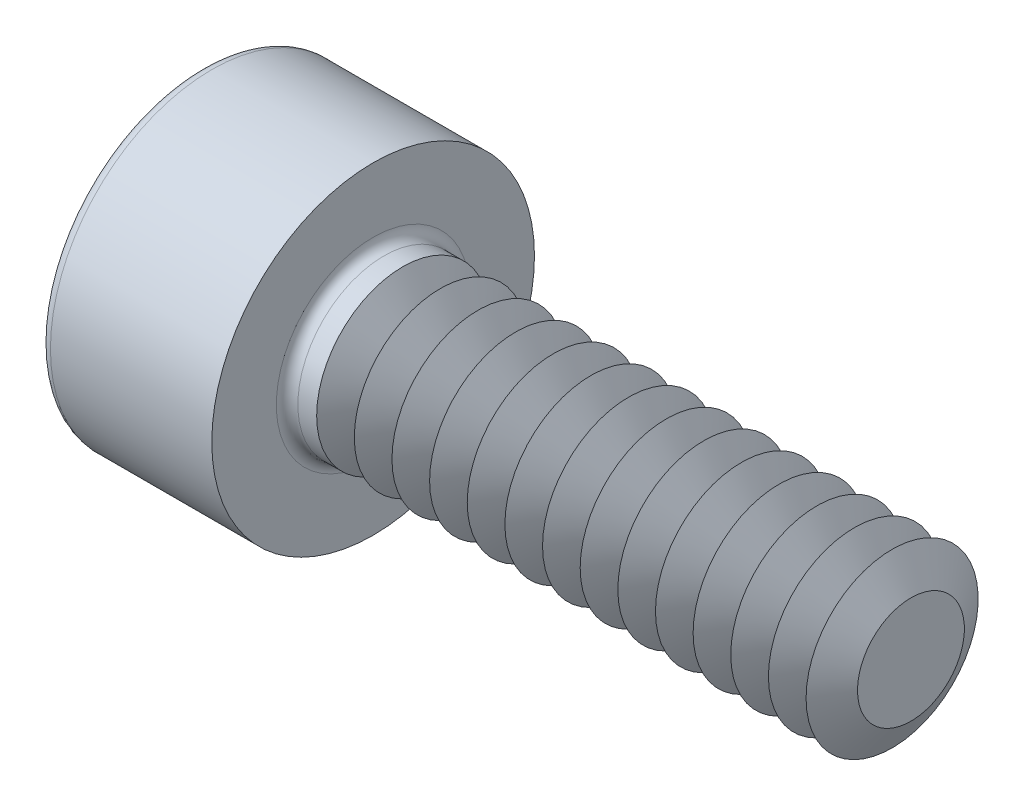
ISO-10303-21;
HEADER;
FILE_DESCRIPTION(('STEP AP214'),'2;1');
FILE_NAME('part.step','',(''),(''),'','','');
FILE_SCHEMA(('AUTOMOTIVE_DESIGN { 1 0 10303 214 1 1 1 1 }'));
ENDSEC;
DATA;
#1=APPLICATION_CONTEXT('core data for automotive mechanical design processes');
#2=APPLICATION_PROTOCOL_DEFINITION('international standard','automotive_design',2000,#1);
#3=PRODUCT_CONTEXT('',#1,'mechanical');
#4=PRODUCT('Part','Part','',(#3));
#5=PRODUCT_RELATED_PRODUCT_CATEGORY('part','',(#4));
#6=PRODUCT_DEFINITION_FORMATION('','',#4);
#7=PRODUCT_DEFINITION_CONTEXT('part definition',#1,'design');
#8=PRODUCT_DEFINITION('design','',#6,#7);
#9=PRODUCT_DEFINITION_SHAPE('','',#8);
#10=(LENGTH_UNIT() NAMED_UNIT(*) SI_UNIT(.MILLI.,.METRE.));
#11=(NAMED_UNIT(*) PLANE_ANGLE_UNIT() SI_UNIT($,.RADIAN.));
#12=(NAMED_UNIT(*) SI_UNIT($,.STERADIAN.) SOLID_ANGLE_UNIT());
#13=UNCERTAINTY_MEASURE_WITH_UNIT(LENGTH_MEASURE(1.E-05),#10,'distance_accuracy_value','');
#14=(GEOMETRIC_REPRESENTATION_CONTEXT(3) GLOBAL_UNCERTAINTY_ASSIGNED_CONTEXT((#13)) GLOBAL_UNIT_ASSIGNED_CONTEXT((#10,
#11,#12)) REPRESENTATION_CONTEXT('',''));
#15=CARTESIAN_POINT('',(0.,0.,0.));
#16=DIRECTION('',(0.,0.,1.));
#17=DIRECTION('',(1.,0.,0.));
#18=AXIS2_PLACEMENT_3D('',#15,#16,#17);
#19=CARTESIAN_POINT('',(5.025,0.,0.));
#20=DIRECTION('',(-1.,0.,0.));
#21=DIRECTION('',(0.,0.,1.));
#22=AXIS2_PLACEMENT_3D('',#19,#20,#21);
#23=CONICAL_SURFACE('',#22,0.8,1.04718484902493);
#24=CARTESIAN_POINT('',(5.2,0.,0.));
#25=DIRECTION('',(-1.,0.,0.));
#26=DIRECTION('',(0.,0.,1.));
#27=AXIS2_PLACEMENT_3D('',#24,#25,#26);
#28=CIRCLE('',#27,0.4969);
#29=CARTESIAN_POINT('',(5.2,0.,0.4969));
#30=VERTEX_POINT('',#29);
#31=EDGE_CURVE('E335',#30,#30,#28,.T.);
#32=ORIENTED_EDGE('',*,*,#31,.T.);
#33=EDGE_LOOP('',(#32));
#34=FACE_BOUND('',#33,.T.);
#35=CARTESIAN_POINT('',(5.025,0.,0.));
#36=DIRECTION('',(-1.,0.,0.));
#37=DIRECTION('',(0.,0.,1.));
#38=AXIS2_PLACEMENT_3D('',#35,#36,#37);
#39=CIRCLE('',#38,0.8);
#40=CARTESIAN_POINT('',(5.025,0.,0.8));
#41=VERTEX_POINT('',#40);
#42=EDGE_CURVE('E322',#41,#41,#39,.T.);
#43=ORIENTED_EDGE('',*,*,#42,.F.);
#44=EDGE_LOOP('',(#43));
#45=FACE_BOUND('',#44,.T.);
#46=ADVANCED_FACE('F47',(#34,#45),#23,.T.);
#47=CARTESIAN_POINT('',(5.2,0.,0.));
#48=DIRECTION('',(1.,0.,0.));
#49=DIRECTION('',(0.,0.,-1.));
#50=AXIS2_PLACEMENT_3D('',#47,#48,#49);
#51=CONICAL_SURFACE('',#50,0.4969,1.04718484902493);
#52=CARTESIAN_POINT('',(5.375,0.,0.));
#53=DIRECTION('',(-1.,0.,0.));
#54=DIRECTION('',(0.,0.,1.));
#55=AXIS2_PLACEMENT_3D('',#52,#53,#54);
#56=CIRCLE('',#55,0.8);
#57=CARTESIAN_POINT('',(5.375,0.,0.8));
#58=VERTEX_POINT('',#57);
#59=EDGE_CURVE('E329',#58,#58,#56,.T.);
#60=ORIENTED_EDGE('',*,*,#59,.T.);
#61=EDGE_LOOP('',(#60));
#62=FACE_BOUND('',#61,.T.);
#63=ORIENTED_EDGE('',*,*,#31,.F.);
#64=EDGE_LOOP('',(#63));
#65=FACE_BOUND('',#64,.T.);
#66=ADVANCED_FACE('F187',(#62,#65),#51,.T.);
#67=CARTESIAN_POINT('',(6.6,0.8,0.));
#68=DIRECTION('',(1.,0.,0.));
#69=DIRECTION('',(0.,0.,-1.));
#70=AXIS2_PLACEMENT_3D('',#67,#68,#69);
#71=PLANE('',#70);
#72=CARTESIAN_POINT('',(6.6,0.,0.));
#73=DIRECTION('',(-1.,0.,0.));
#74=DIRECTION('',(0.,0.,1.));
#75=AXIS2_PLACEMENT_3D('',#72,#73,#74);
#76=CIRCLE('',#75,0.4969);
#77=CARTESIAN_POINT('',(6.6,0.,0.4969));
#78=VERTEX_POINT('',#77);
#79=EDGE_CURVE('E139',#78,#78,#76,.T.);
#80=ORIENTED_EDGE('',*,*,#79,.F.);
#81=EDGE_LOOP('',(#80));
#82=FACE_BOUND('',#81,.T.);
#83=ADVANCED_FACE('F192',(#82),#71,.T.);
#84=CARTESIAN_POINT('',(6.425,0.,0.));
#85=DIRECTION('',(-1.,0.,0.));
#86=DIRECTION('',(0.,0.,1.));
#87=AXIS2_PLACEMENT_3D('',#84,#85,#86);
#88=CONICAL_SURFACE('',#87,0.8,1.04718484902493);
#89=ORIENTED_EDGE('',*,*,#79,.T.);
#90=EDGE_LOOP('',(#89));
#91=FACE_BOUND('',#90,.T.);
#92=CARTESIAN_POINT('',(6.425,0.,0.));
#93=DIRECTION('',(-1.,0.,0.));
#94=DIRECTION('',(0.,0.,1.));
#95=AXIS2_PLACEMENT_3D('',#92,#93,#94);
#96=CIRCLE('',#95,0.8);
#97=CARTESIAN_POINT('',(6.425,0.,0.8));
#98=VERTEX_POINT('',#97);
#99=EDGE_CURVE('E347',#98,#98,#96,.T.);
#100=ORIENTED_EDGE('',*,*,#99,.F.);
#101=EDGE_LOOP('',(#100));
#102=FACE_BOUND('',#101,.T.);
#103=ADVANCED_FACE('F223',(#91,#102),#88,.T.);
#104=CARTESIAN_POINT('',(6.25,0.,0.));
#105=DIRECTION('',(1.,0.,0.));
#106=DIRECTION('',(0.,0.,-1.));
#107=AXIS2_PLACEMENT_3D('',#104,#105,#106);
#108=CONICAL_SURFACE('',#107,0.4969,1.04718484902493);
#109=ORIENTED_EDGE('',*,*,#99,.T.);
#110=EDGE_LOOP('',(#109));
#111=FACE_BOUND('',#110,.T.);
#112=CARTESIAN_POINT('',(6.25,0.,0.));
#113=DIRECTION('',(-1.,0.,0.));
#114=DIRECTION('',(0.,0.,1.));
#115=AXIS2_PLACEMENT_3D('',#112,#113,#114);
#116=CIRCLE('',#115,0.4969);
#117=CARTESIAN_POINT('',(6.25,0.,0.4969));
#118=VERTEX_POINT('',#117);
#119=EDGE_CURVE('E349',#118,#118,#116,.T.);
#120=ORIENTED_EDGE('',*,*,#119,.F.);
#121=EDGE_LOOP('',(#120));
#122=FACE_BOUND('',#121,.T.);
#123=ADVANCED_FACE('F218',(#111,#122),#108,.T.);
#124=CARTESIAN_POINT('',(6.075,0.,0.));
#125=DIRECTION('',(-1.,0.,0.));
#126=DIRECTION('',(0.,0.,1.));
#127=AXIS2_PLACEMENT_3D('',#124,#125,#126);
#128=CONICAL_SURFACE('',#127,0.8,1.04718484902493);
#129=ORIENTED_EDGE('',*,*,#119,.T.);
#130=EDGE_LOOP('',(#129));
#131=FACE_BOUND('',#130,.T.);
#132=CARTESIAN_POINT('',(6.075,0.,0.));
#133=DIRECTION('',(-1.,0.,0.));
#134=DIRECTION('',(0.,0.,1.));
#135=AXIS2_PLACEMENT_3D('',#132,#133,#134);
#136=CIRCLE('',#135,0.8);
#137=CARTESIAN_POINT('',(6.075,0.,0.8));
#138=VERTEX_POINT('',#137);
#139=EDGE_CURVE('E338',#138,#138,#136,.T.);
#140=ORIENTED_EDGE('',*,*,#139,.F.);
#141=EDGE_LOOP('',(#140));
#142=FACE_BOUND('',#141,.T.);
#143=ADVANCED_FACE('F212',(#131,#142),#128,.T.);
#144=CARTESIAN_POINT('',(5.9,0.,0.));
#145=DIRECTION('',(1.,0.,0.));
#146=DIRECTION('',(0.,0.,-1.));
#147=AXIS2_PLACEMENT_3D('',#144,#145,#146);
#148=CONICAL_SURFACE('',#147,0.4969,1.04718484902493);
#149=ORIENTED_EDGE('',*,*,#139,.T.);
#150=EDGE_LOOP('',(#149));
#151=FACE_BOUND('',#150,.T.);
#152=CARTESIAN_POINT('',(5.9,0.,0.));
#153=DIRECTION('',(-1.,0.,0.));
#154=DIRECTION('',(0.,0.,1.));
#155=AXIS2_PLACEMENT_3D('',#152,#153,#154);
#156=CIRCLE('',#155,0.4969);
#157=CARTESIAN_POINT('',(5.9,0.,0.4969));
#158=VERTEX_POINT('',#157);
#159=EDGE_CURVE('E342',#158,#158,#156,.T.);
#160=ORIENTED_EDGE('',*,*,#159,.F.);
#161=EDGE_LOOP('',(#160));
#162=FACE_BOUND('',#161,.T.);
#163=ADVANCED_FACE('F208',(#151,#162),#148,.T.);
#164=CARTESIAN_POINT('',(5.725,0.,0.));
#165=DIRECTION('',(-1.,0.,0.));
#166=DIRECTION('',(0.,0.,1.));
#167=AXIS2_PLACEMENT_3D('',#164,#165,#166);
#168=CONICAL_SURFACE('',#167,0.8,1.04718484902493);
#169=ORIENTED_EDGE('',*,*,#159,.T.);
#170=EDGE_LOOP('',(#169));
#171=FACE_BOUND('',#170,.T.);
#172=CARTESIAN_POINT('',(5.725,0.,0.));
#173=DIRECTION('',(-1.,0.,0.));
#174=DIRECTION('',(0.,0.,1.));
#175=AXIS2_PLACEMENT_3D('',#172,#173,#174);
#176=CIRCLE('',#175,0.8);
#177=CARTESIAN_POINT('',(5.725,0.,0.8));
#178=VERTEX_POINT('',#177);
#179=EDGE_CURVE('E334',#178,#178,#176,.T.);
#180=ORIENTED_EDGE('',*,*,#179,.F.);
#181=EDGE_LOOP('',(#180));
#182=FACE_BOUND('',#181,.T.);
#183=ADVANCED_FACE('F204',(#171,#182),#168,.T.);
#184=CARTESIAN_POINT('',(5.55,0.,0.));
#185=DIRECTION('',(1.,0.,0.));
#186=DIRECTION('',(0.,0.,-1.));
#187=AXIS2_PLACEMENT_3D('',#184,#185,#186);
#188=CONICAL_SURFACE('',#187,0.4969,1.04718484902493);
#189=ORIENTED_EDGE('',*,*,#179,.T.);
#190=EDGE_LOOP('',(#189));
#191=FACE_BOUND('',#190,.T.);
#192=CARTESIAN_POINT('',(5.55,0.,0.));
#193=DIRECTION('',(-1.,0.,0.));
#194=DIRECTION('',(0.,0.,1.));
#195=AXIS2_PLACEMENT_3D('',#192,#193,#194);
#196=CIRCLE('',#195,0.4969);
#197=CARTESIAN_POINT('',(5.55,0.,0.4969));
#198=VERTEX_POINT('',#197);
#199=EDGE_CURVE('E340',#198,#198,#196,.T.);
#200=ORIENTED_EDGE('',*,*,#199,.F.);
#201=EDGE_LOOP('',(#200));
#202=FACE_BOUND('',#201,.T.);
#203=ADVANCED_FACE('F196',(#191,#202),#188,.T.);
#204=CARTESIAN_POINT('',(5.375,0.,0.));
#205=DIRECTION('',(-1.,0.,0.));
#206=DIRECTION('',(0.,0.,1.));
#207=AXIS2_PLACEMENT_3D('',#204,#205,#206);
#208=CONICAL_SURFACE('',#207,0.8,1.04718484902493);
#209=ORIENTED_EDGE('',*,*,#199,.T.);
#210=EDGE_LOOP('',(#209));
#211=FACE_BOUND('',#210,.T.);
#212=ORIENTED_EDGE('',*,*,#59,.F.);
#213=EDGE_LOOP('',(#212));
#214=FACE_BOUND('',#213,.T.);
#215=ADVANCED_FACE('F201',(#211,#214),#208,.T.);
#216=CARTESIAN_POINT('',(4.675,0.,0.));
#217=DIRECTION('',(-1.,0.,0.));
#218=DIRECTION('',(0.,0.,1.));
#219=AXIS2_PLACEMENT_3D('',#216,#217,#218);
#220=CONICAL_SURFACE('',#219,0.8,1.04718484902493);
#221=CARTESIAN_POINT('',(4.85,0.,0.));
#222=DIRECTION('',(-1.,0.,0.));
#223=DIRECTION('',(0.,0.,1.));
#224=AXIS2_PLACEMENT_3D('',#221,#222,#223);
#225=CIRCLE('',#224,0.4969);
#226=CARTESIAN_POINT('',(4.85,0.,0.4969));
#227=VERTEX_POINT('',#226);
#228=EDGE_CURVE('E327',#227,#227,#225,.T.);
#229=ORIENTED_EDGE('',*,*,#228,.T.);
#230=EDGE_LOOP('',(#229));
#231=FACE_BOUND('',#230,.T.);
#232=CARTESIAN_POINT('',(4.675,0.,0.));
#233=DIRECTION('',(-1.,0.,0.));
#234=DIRECTION('',(0.,0.,1.));
#235=AXIS2_PLACEMENT_3D('',#232,#233,#234);
#236=CIRCLE('',#235,0.8);
#237=CARTESIAN_POINT('',(4.675,0.,0.8));
#238=VERTEX_POINT('',#237);
#239=EDGE_CURVE('E320',#238,#238,#236,.T.);
#240=ORIENTED_EDGE('',*,*,#239,.F.);
#241=EDGE_LOOP('',(#240));
#242=FACE_BOUND('',#241,.T.);
#243=ADVANCED_FACE('F206',(#231,#242),#220,.T.);
#244=CARTESIAN_POINT('',(4.85,0.,0.));
#245=DIRECTION('',(1.,0.,0.));
#246=DIRECTION('',(0.,0.,-1.));
#247=AXIS2_PLACEMENT_3D('',#244,#245,#246);
#248=CONICAL_SURFACE('',#247,0.4969,1.04718484902493);
#249=ORIENTED_EDGE('',*,*,#42,.T.);
#250=EDGE_LOOP('',(#249));
#251=FACE_BOUND('',#250,.T.);
#252=ORIENTED_EDGE('',*,*,#228,.F.);
#253=EDGE_LOOP('',(#252));
#254=FACE_BOUND('',#253,.T.);
#255=ADVANCED_FACE('F541',(#251,#254),#248,.T.);
#256=CARTESIAN_POINT('',(4.325,0.,0.));
#257=DIRECTION('',(-1.,0.,0.));
#258=DIRECTION('',(0.,0.,1.));
#259=AXIS2_PLACEMENT_3D('',#256,#257,#258);
#260=CONICAL_SURFACE('',#259,0.8,1.04718484902493);
#261=CARTESIAN_POINT('',(4.5,0.,0.));
#262=DIRECTION('',(-1.,0.,0.));
#263=DIRECTION('',(0.,0.,1.));
#264=AXIS2_PLACEMENT_3D('',#261,#262,#263);
#265=CIRCLE('',#264,0.4969);
#266=CARTESIAN_POINT('',(4.5,0.,0.4969));
#267=VERTEX_POINT('',#266);
#268=EDGE_CURVE('E318',#267,#267,#265,.T.);
#269=ORIENTED_EDGE('',*,*,#268,.T.);
#270=EDGE_LOOP('',(#269));
#271=FACE_BOUND('',#270,.T.);
#272=CARTESIAN_POINT('',(4.325,0.,0.));
#273=DIRECTION('',(-1.,0.,0.));
#274=DIRECTION('',(0.,0.,1.));
#275=AXIS2_PLACEMENT_3D('',#272,#273,#274);
#276=CIRCLE('',#275,0.8);
#277=CARTESIAN_POINT('',(4.325,0.,0.8));
#278=VERTEX_POINT('',#277);
#279=EDGE_CURVE('E311',#278,#278,#276,.T.);
#280=ORIENTED_EDGE('',*,*,#279,.F.);
#281=EDGE_LOOP('',(#280));
#282=FACE_BOUND('',#281,.T.);
#283=ADVANCED_FACE('F536',(#271,#282),#260,.T.);
#284=CARTESIAN_POINT('',(4.5,0.,0.));
#285=DIRECTION('',(1.,0.,0.));
#286=DIRECTION('',(0.,0.,-1.));
#287=AXIS2_PLACEMENT_3D('',#284,#285,#286);
#288=CONICAL_SURFACE('',#287,0.4969,1.04718484902493);
#289=ORIENTED_EDGE('',*,*,#239,.T.);
#290=EDGE_LOOP('',(#289));
#291=FACE_BOUND('',#290,.T.);
#292=ORIENTED_EDGE('',*,*,#268,.F.);
#293=EDGE_LOOP('',(#292));
#294=FACE_BOUND('',#293,.T.);
#295=ADVANCED_FACE('F530',(#291,#294),#288,.T.);
#296=CARTESIAN_POINT('',(3.975,0.,0.));
#297=DIRECTION('',(-1.,0.,0.));
#298=DIRECTION('',(0.,0.,1.));
#299=AXIS2_PLACEMENT_3D('',#296,#297,#298);
#300=CONICAL_SURFACE('',#299,0.8,1.04718484902493);
#301=CARTESIAN_POINT('',(4.15,0.,0.));
#302=DIRECTION('',(-1.,0.,0.));
#303=DIRECTION('',(0.,0.,1.));
#304=AXIS2_PLACEMENT_3D('',#301,#302,#303);
#305=CIRCLE('',#304,0.4969);
#306=CARTESIAN_POINT('',(4.15,0.,0.4969));
#307=VERTEX_POINT('',#306);
#308=EDGE_CURVE('E313',#307,#307,#305,.T.);
#309=ORIENTED_EDGE('',*,*,#308,.T.);
#310=EDGE_LOOP('',(#309));
#311=FACE_BOUND('',#310,.T.);
#312=CARTESIAN_POINT('',(3.975,0.,0.));
#313=DIRECTION('',(-1.,0.,0.));
#314=DIRECTION('',(0.,0.,1.));
#315=AXIS2_PLACEMENT_3D('',#312,#313,#314);
#316=CIRCLE('',#315,0.8);
#317=CARTESIAN_POINT('',(3.975,0.,0.8));
#318=VERTEX_POINT('',#317);
#319=EDGE_CURVE('E304',#318,#318,#316,.T.);
#320=ORIENTED_EDGE('',*,*,#319,.F.);
#321=EDGE_LOOP('',(#320));
#322=FACE_BOUND('',#321,.T.);
#323=ADVANCED_FACE('F517',(#311,#322),#300,.T.);
#324=CARTESIAN_POINT('',(4.15,0.,0.));
#325=DIRECTION('',(1.,0.,0.));
#326=DIRECTION('',(0.,0.,-1.));
#327=AXIS2_PLACEMENT_3D('',#324,#325,#326);
#328=CONICAL_SURFACE('',#327,0.4969,1.04718484902493);
#329=ORIENTED_EDGE('',*,*,#279,.T.);
#330=EDGE_LOOP('',(#329));
#331=FACE_BOUND('',#330,.T.);
#332=ORIENTED_EDGE('',*,*,#308,.F.);
#333=EDGE_LOOP('',(#332));
#334=FACE_BOUND('',#333,.T.);
#335=ADVANCED_FACE('F508',(#331,#334),#328,.T.);
#336=CARTESIAN_POINT('',(3.625,0.,0.));
#337=DIRECTION('',(-1.,0.,0.));
#338=DIRECTION('',(0.,0.,1.));
#339=AXIS2_PLACEMENT_3D('',#336,#337,#338);
#340=CONICAL_SURFACE('',#339,0.8,1.04718484902493);
#341=CARTESIAN_POINT('',(3.8,0.,0.));
#342=DIRECTION('',(-1.,0.,0.));
#343=DIRECTION('',(0.,0.,1.));
#344=AXIS2_PLACEMENT_3D('',#341,#342,#343);
#345=CIRCLE('',#344,0.4969);
#346=CARTESIAN_POINT('',(3.8,0.,0.4969));
#347=VERTEX_POINT('',#346);
#348=EDGE_CURVE('E308',#347,#347,#345,.T.);
#349=ORIENTED_EDGE('',*,*,#348,.T.);
#350=EDGE_LOOP('',(#349));
#351=FACE_BOUND('',#350,.T.);
#352=CARTESIAN_POINT('',(3.625,0.,0.));
#353=DIRECTION('',(-1.,0.,0.));
#354=DIRECTION('',(0.,0.,1.));
#355=AXIS2_PLACEMENT_3D('',#352,#353,#354);
#356=CIRCLE('',#355,0.8);
#357=CARTESIAN_POINT('',(3.625,0.,0.8));
#358=VERTEX_POINT('',#357);
#359=EDGE_CURVE('E299',#358,#358,#356,.T.);
#360=ORIENTED_EDGE('',*,*,#359,.F.);
#361=EDGE_LOOP('',(#360));
#362=FACE_BOUND('',#361,.T.);
#363=ADVANCED_FACE('F499',(#351,#362),#340,.T.);
#364=CARTESIAN_POINT('',(3.8,0.,0.));
#365=DIRECTION('',(1.,0.,0.));
#366=DIRECTION('',(0.,0.,-1.));
#367=AXIS2_PLACEMENT_3D('',#364,#365,#366);
#368=CONICAL_SURFACE('',#367,0.4969,1.04718484902493);
#369=ORIENTED_EDGE('',*,*,#319,.T.);
#370=EDGE_LOOP('',(#369));
#371=FACE_BOUND('',#370,.T.);
#372=ORIENTED_EDGE('',*,*,#348,.F.);
#373=EDGE_LOOP('',(#372));
#374=FACE_BOUND('',#373,.T.);
#375=ADVANCED_FACE('F493',(#371,#374),#368,.T.);
#376=CARTESIAN_POINT('',(3.275,0.,0.));
#377=DIRECTION('',(-1.,0.,0.));
#378=DIRECTION('',(0.,0.,1.));
#379=AXIS2_PLACEMENT_3D('',#376,#377,#378);
#380=CONICAL_SURFACE('',#379,0.8,1.04718484902493);
#381=CARTESIAN_POINT('',(3.45,0.,0.));
#382=DIRECTION('',(-1.,0.,0.));
#383=DIRECTION('',(0.,0.,1.));
#384=AXIS2_PLACEMENT_3D('',#381,#382,#383);
#385=CIRCLE('',#384,0.4969);
#386=CARTESIAN_POINT('',(3.45,0.,0.4969));
#387=VERTEX_POINT('',#386);
#388=EDGE_CURVE('E305',#387,#387,#385,.T.);
#389=ORIENTED_EDGE('',*,*,#388,.T.);
#390=EDGE_LOOP('',(#389));
#391=FACE_BOUND('',#390,.T.);
#392=CARTESIAN_POINT('',(3.275,0.,0.));
#393=DIRECTION('',(-1.,0.,0.));
#394=DIRECTION('',(0.,0.,1.));
#395=AXIS2_PLACEMENT_3D('',#392,#393,#394);
#396=CIRCLE('',#395,0.8);
#397=CARTESIAN_POINT('',(3.275,0.,0.8));
#398=VERTEX_POINT('',#397);
#399=EDGE_CURVE('E291',#398,#398,#396,.T.);
#400=ORIENTED_EDGE('',*,*,#399,.F.);
#401=EDGE_LOOP('',(#400));
#402=FACE_BOUND('',#401,.T.);
#403=ADVANCED_FACE('F485',(#391,#402),#380,.T.);
#404=CARTESIAN_POINT('',(3.45,0.,0.));
#405=DIRECTION('',(1.,0.,0.));
#406=DIRECTION('',(0.,0.,-1.));
#407=AXIS2_PLACEMENT_3D('',#404,#405,#406);
#408=CONICAL_SURFACE('',#407,0.4969,1.04718484902493);
#409=ORIENTED_EDGE('',*,*,#359,.T.);
#410=EDGE_LOOP('',(#409));
#411=FACE_BOUND('',#410,.T.);
#412=ORIENTED_EDGE('',*,*,#388,.F.);
#413=EDGE_LOOP('',(#412));
#414=FACE_BOUND('',#413,.T.);
#415=ADVANCED_FACE('F472',(#411,#414),#408,.T.);
#416=CARTESIAN_POINT('',(2.925,0.,0.));
#417=DIRECTION('',(-1.,0.,0.));
#418=DIRECTION('',(0.,0.,1.));
#419=AXIS2_PLACEMENT_3D('',#416,#417,#418);
#420=CONICAL_SURFACE('',#419,0.8,1.04718484902493);
#421=CARTESIAN_POINT('',(3.1,0.,0.));
#422=DIRECTION('',(-1.,0.,0.));
#423=DIRECTION('',(0.,0.,1.));
#424=AXIS2_PLACEMENT_3D('',#421,#422,#423);
#425=CIRCLE('',#424,0.4969);
#426=CARTESIAN_POINT('',(3.1,0.,0.4969));
#427=VERTEX_POINT('',#426);
#428=EDGE_CURVE('E298',#427,#427,#425,.T.);
#429=ORIENTED_EDGE('',*,*,#428,.T.);
#430=EDGE_LOOP('',(#429));
#431=FACE_BOUND('',#430,.T.);
#432=CARTESIAN_POINT('',(2.925,0.,0.));
#433=DIRECTION('',(-1.,0.,0.));
#434=DIRECTION('',(0.,0.,1.));
#435=AXIS2_PLACEMENT_3D('',#432,#433,#434);
#436=CIRCLE('',#435,0.8);
#437=CARTESIAN_POINT('',(2.925,0.,0.8));
#438=VERTEX_POINT('',#437);
#439=EDGE_CURVE('E290',#438,#438,#436,.T.);
#440=ORIENTED_EDGE('',*,*,#439,.F.);
#441=EDGE_LOOP('',(#440));
#442=FACE_BOUND('',#441,.T.);
#443=ADVANCED_FACE('F464',(#431,#442),#420,.T.);
#444=CARTESIAN_POINT('',(3.1,0.,0.));
#445=DIRECTION('',(1.,0.,0.));
#446=DIRECTION('',(0.,0.,-1.));
#447=AXIS2_PLACEMENT_3D('',#444,#445,#446);
#448=CONICAL_SURFACE('',#447,0.4969,1.04718484902493);
#449=ORIENTED_EDGE('',*,*,#399,.T.);
#450=EDGE_LOOP('',(#449));
#451=FACE_BOUND('',#450,.T.);
#452=ORIENTED_EDGE('',*,*,#428,.F.);
#453=EDGE_LOOP('',(#452));
#454=FACE_BOUND('',#453,.T.);
#455=ADVANCED_FACE('F454',(#451,#454),#448,.T.);
#456=CARTESIAN_POINT('',(2.575,0.,0.));
#457=DIRECTION('',(-1.,0.,0.));
#458=DIRECTION('',(0.,0.,1.));
#459=AXIS2_PLACEMENT_3D('',#456,#457,#458);
#460=CONICAL_SURFACE('',#459,0.8,1.04718484902493);
#461=CARTESIAN_POINT('',(2.75,0.,0.));
#462=DIRECTION('',(-1.,0.,0.));
#463=DIRECTION('',(0.,0.,1.));
#464=AXIS2_PLACEMENT_3D('',#461,#462,#463);
#465=CIRCLE('',#464,0.4969);
#466=CARTESIAN_POINT('',(2.75,0.,0.4969));
#467=VERTEX_POINT('',#466);
#468=EDGE_CURVE('E287',#467,#467,#465,.T.);
#469=ORIENTED_EDGE('',*,*,#468,.T.);
#470=EDGE_LOOP('',(#469));
#471=FACE_BOUND('',#470,.T.);
#472=CARTESIAN_POINT('',(2.575,0.,0.));
#473=DIRECTION('',(-1.,0.,0.));
#474=DIRECTION('',(0.,0.,1.));
#475=AXIS2_PLACEMENT_3D('',#472,#473,#474);
#476=CIRCLE('',#475,0.8);
#477=CARTESIAN_POINT('',(2.575,0.,0.8));
#478=VERTEX_POINT('',#477);
#479=EDGE_CURVE('E282',#478,#478,#476,.T.);
#480=ORIENTED_EDGE('',*,*,#479,.F.);
#481=EDGE_LOOP('',(#480));
#482=FACE_BOUND('',#481,.T.);
#483=ADVANCED_FACE('F447',(#471,#482),#460,.T.);
#484=CARTESIAN_POINT('',(2.75,0.,0.));
#485=DIRECTION('',(1.,0.,0.));
#486=DIRECTION('',(0.,0.,-1.));
#487=AXIS2_PLACEMENT_3D('',#484,#485,#486);
#488=CONICAL_SURFACE('',#487,0.4969,1.04718484902493);
#489=ORIENTED_EDGE('',*,*,#439,.T.);
#490=EDGE_LOOP('',(#489));
#491=FACE_BOUND('',#490,.T.);
#492=ORIENTED_EDGE('',*,*,#468,.F.);
#493=EDGE_LOOP('',(#492));
#494=FACE_BOUND('',#493,.T.);
#495=ADVANCED_FACE('F440',(#491,#494),#488,.T.);
#496=CARTESIAN_POINT('',(2.225,0.,0.));
#497=DIRECTION('',(-1.,0.,0.));
#498=DIRECTION('',(0.,0.,1.));
#499=AXIS2_PLACEMENT_3D('',#496,#497,#498);
#500=CONICAL_SURFACE('',#499,0.8,1.04718484902493);
#501=CARTESIAN_POINT('',(2.4,0.,0.));
#502=DIRECTION('',(-1.,0.,0.));
#503=DIRECTION('',(0.,0.,1.));
#504=AXIS2_PLACEMENT_3D('',#501,#502,#503);
#505=CIRCLE('',#504,0.4969);
#506=CARTESIAN_POINT('',(2.4,0.,0.4969));
#507=VERTEX_POINT('',#506);
#508=EDGE_CURVE('E284',#507,#507,#505,.T.);
#509=ORIENTED_EDGE('',*,*,#508,.T.);
#510=EDGE_LOOP('',(#509));
#511=FACE_BOUND('',#510,.T.);
#512=CARTESIAN_POINT('',(2.225,0.,0.));
#513=DIRECTION('',(-1.,0.,0.));
#514=DIRECTION('',(0.,0.,1.));
#515=AXIS2_PLACEMENT_3D('',#512,#513,#514);
#516=CIRCLE('',#515,0.8);
#517=CARTESIAN_POINT('',(2.225,0.,0.8));
#518=VERTEX_POINT('',#517);
#519=EDGE_CURVE('E271',#518,#518,#516,.T.);
#520=ORIENTED_EDGE('',*,*,#519,.F.);
#521=EDGE_LOOP('',(#520));
#522=FACE_BOUND('',#521,.T.);
#523=ADVANCED_FACE('F426',(#511,#522),#500,.T.);
#524=CARTESIAN_POINT('',(2.4,0.,0.));
#525=DIRECTION('',(1.,0.,0.));
#526=DIRECTION('',(0.,0.,-1.));
#527=AXIS2_PLACEMENT_3D('',#524,#525,#526);
#528=CONICAL_SURFACE('',#527,0.4969,1.04718484902493);
#529=ORIENTED_EDGE('',*,*,#479,.T.);
#530=EDGE_LOOP('',(#529));
#531=FACE_BOUND('',#530,.T.);
#532=ORIENTED_EDGE('',*,*,#508,.F.);
#533=EDGE_LOOP('',(#532));
#534=FACE_BOUND('',#533,.T.);
#535=ADVANCED_FACE('F419',(#531,#534),#528,.T.);
#536=CARTESIAN_POINT('',(1.875,0.,0.));
#537=DIRECTION('',(-1.,0.,0.));
#538=DIRECTION('',(0.,0.,1.));
#539=AXIS2_PLACEMENT_3D('',#536,#537,#538);
#540=CONICAL_SURFACE('',#539,0.8,1.04718484902493);
#541=CARTESIAN_POINT('',(2.05,0.,0.));
#542=DIRECTION('',(-1.,0.,0.));
#543=DIRECTION('',(0.,0.,1.));
#544=AXIS2_PLACEMENT_3D('',#541,#542,#543);
#545=CIRCLE('',#544,0.4969);
#546=CARTESIAN_POINT('',(2.05,0.,0.4969));
#547=VERTEX_POINT('',#546);
#548=EDGE_CURVE('E276',#547,#547,#545,.T.);
#549=ORIENTED_EDGE('',*,*,#548,.T.);
#550=EDGE_LOOP('',(#549));
#551=FACE_BOUND('',#550,.T.);
#552=CARTESIAN_POINT('',(1.875,0.,0.));
#553=DIRECTION('',(-1.,0.,0.));
#554=DIRECTION('',(0.,0.,1.));
#555=AXIS2_PLACEMENT_3D('',#552,#553,#554);
#556=CIRCLE('',#555,0.8);
#557=CARTESIAN_POINT('',(1.875,0.,0.8));
#558=VERTEX_POINT('',#557);
#559=EDGE_CURVE('E272',#558,#558,#556,.T.);
#560=ORIENTED_EDGE('',*,*,#559,.F.);
#561=EDGE_LOOP('',(#560));
#562=FACE_BOUND('',#561,.T.);
#563=ADVANCED_FACE('F409',(#551,#562),#540,.T.);
#564=CARTESIAN_POINT('',(2.05,0.,0.));
#565=DIRECTION('',(1.,0.,0.));
#566=DIRECTION('',(0.,0.,-1.));
#567=AXIS2_PLACEMENT_3D('',#564,#565,#566);
#568=CONICAL_SURFACE('',#567,0.4969,1.04718484902493);
#569=ORIENTED_EDGE('',*,*,#519,.T.);
#570=EDGE_LOOP('',(#569));
#571=FACE_BOUND('',#570,.T.);
#572=ORIENTED_EDGE('',*,*,#548,.F.);
#573=EDGE_LOOP('',(#572));
#574=FACE_BOUND('',#573,.T.);
#575=ADVANCED_FACE('F233',(#571,#574),#568,.T.);
#576=CARTESIAN_POINT('',(0.7,-0.4325,0.749111974273539));
#577=DIRECTION('',(-1.,0.,0.));
#578=DIRECTION('',(0.,0.,1.));
#579=AXIS2_PLACEMENT_3D('',#576,#577,#578);
#580=PLANE('',#579);
#581=DIRECTION('',(0.,0.5,0.866025403784439));
#582=VECTOR('',#581,1.);
#583=CARTESIAN_POINT('',(0.7,-0.865,0.));
#584=LINE('',#583,#582);
#585=CARTESIAN_POINT('',(0.7,-0.865,0.));
#586=VERTEX_POINT('',#585);
#587=CARTESIAN_POINT('',(0.7,-0.432500000000001,0.749111974273539));
#588=VERTEX_POINT('',#587);
#589=EDGE_CURVE('E149',#586,#588,#584,.T.);
#590=ORIENTED_EDGE('',*,*,#589,.T.);
#591=DIRECTION('',(0.,1.,0.));
#592=VECTOR('',#591,1.);
#593=CARTESIAN_POINT('',(0.7,-0.432500000000001,0.749111974273539));
#594=LINE('',#593,#592);
#595=CARTESIAN_POINT('',(0.7,0.432499999999999,0.749111974273539));
#596=VERTEX_POINT('',#595);
#597=EDGE_CURVE('E135',#588,#596,#594,.T.);
#598=ORIENTED_EDGE('',*,*,#597,.T.);
#599=DIRECTION('',(0.,0.5,-0.866025403784439));
#600=VECTOR('',#599,1.);
#601=CARTESIAN_POINT('',(0.7,0.432499999999999,0.749111974273539));
#602=LINE('',#601,#600);
#603=CARTESIAN_POINT('',(0.7,0.864999999999999,0.));
#604=VERTEX_POINT('',#603);
#605=EDGE_CURVE('E129',#596,#604,#602,.T.);
#606=ORIENTED_EDGE('',*,*,#605,.T.);
#607=DIRECTION('',(0.,-0.499999999999999,-0.866025403784439));
#608=VECTOR('',#607,1.);
#609=CARTESIAN_POINT('',(0.7,0.864999999999999,0.));
#610=LINE('',#609,#608);
#611=CARTESIAN_POINT('',(0.7,0.4325,-0.74911197427354));
#612=VERTEX_POINT('',#611);
#613=EDGE_CURVE('E107',#604,#612,#610,.T.);
#614=ORIENTED_EDGE('',*,*,#613,.T.);
#615=DIRECTION('',(0.,-1.,0.));
#616=VECTOR('',#615,1.);
#617=CARTESIAN_POINT('',(0.7,0.4325,-0.74911197427354));
#618=LINE('',#617,#616);
#619=CARTESIAN_POINT('',(0.7,-0.432500000000001,-0.74911197427354));
#620=VERTEX_POINT('',#619);
#621=EDGE_CURVE('E119',#612,#620,#618,.T.);
#622=ORIENTED_EDGE('',*,*,#621,.T.);
#623=DIRECTION('',(0.,-0.5,0.866025403784439));
#624=VECTOR('',#623,1.);
#625=CARTESIAN_POINT('',(0.7,-0.432500000000001,-0.74911197427354));
#626=LINE('',#625,#624);
#627=EDGE_CURVE('E121',#620,#586,#626,.T.);
#628=ORIENTED_EDGE('',*,*,#627,.T.);
#629=EDGE_LOOP('',(#590,#598,#606,#614,#622,#628));
#630=FACE_BOUND('',#629,.T.);
#631=ADVANCED_FACE('F130',(#630),#580,.T.);
#632=CARTESIAN_POINT('',(0.7,-0.432500000000001,0.749111974273539));
#633=DIRECTION('',(0.,0.,1.));
#634=DIRECTION('',(1.,0.,0.));
#635=AXIS2_PLACEMENT_3D('',#632,#633,#634);
#636=PLANE('',#635);
#637=DIRECTION('',(0.,1.,0.));
#638=VECTOR('',#637,1.);
#639=CARTESIAN_POINT('',(0.,-0.432500000000001,0.749111974273539));
#640=LINE('',#639,#638);
#641=CARTESIAN_POINT('',(0.,-0.432500000000001,0.749111974273539));
#642=VERTEX_POINT('',#641);
#643=CARTESIAN_POINT('',(0.,0.432499999999999,0.749111974273539));
#644=VERTEX_POINT('',#643);
#645=EDGE_CURVE('E136',#642,#644,#640,.T.);
#646=ORIENTED_EDGE('',*,*,#645,.T.);
#647=DIRECTION('',(-1.,0.,0.));
#648=VECTOR('',#647,1.);
#649=CARTESIAN_POINT('',(0.7,0.432499999999999,0.749111974273539));
#650=LINE('',#649,#648);
#651=EDGE_CURVE('E151',#596,#644,#650,.T.);
#652=ORIENTED_EDGE('',*,*,#651,.F.);
#653=ORIENTED_EDGE('',*,*,#597,.F.);
#654=DIRECTION('',(-1.,0.,0.));
#655=VECTOR('',#654,1.);
#656=CARTESIAN_POINT('',(0.7,-0.432500000000001,0.749111974273539));
#657=LINE('',#656,#655);
#658=EDGE_CURVE('E94',#588,#642,#657,.T.);
#659=ORIENTED_EDGE('',*,*,#658,.T.);
#660=EDGE_LOOP('',(#646,#652,#653,#659));
#661=FACE_BOUND('',#660,.T.);
#662=ADVANCED_FACE('F229',(#661),#636,.F.);
#663=CARTESIAN_POINT('',(0.7,0.432499999999999,0.749111974273539));
#664=DIRECTION('',(0.,0.866025403784439,0.5));
#665=DIRECTION('',(0.,-0.5,0.866025403784439));
#666=AXIS2_PLACEMENT_3D('',#663,#664,#665);
#667=PLANE('',#666);
#668=DIRECTION('',(0.,0.5,-0.866025403784439));
#669=VECTOR('',#668,1.);
#670=CARTESIAN_POINT('',(0.,0.432499999999999,0.749111974273539));
#671=LINE('',#670,#669);
#672=CARTESIAN_POINT('',(0.,0.864999999999999,0.));
#673=VERTEX_POINT('',#672);
#674=EDGE_CURVE('E145',#644,#673,#671,.T.);
#675=ORIENTED_EDGE('',*,*,#674,.T.);
#676=DIRECTION('',(-1.,0.,0.));
#677=VECTOR('',#676,1.);
#678=CARTESIAN_POINT('',(0.7,0.864999999999999,0.));
#679=LINE('',#678,#677);
#680=EDGE_CURVE('E120',#604,#673,#679,.T.);
#681=ORIENTED_EDGE('',*,*,#680,.F.);
#682=ORIENTED_EDGE('',*,*,#605,.F.);
#683=ORIENTED_EDGE('',*,*,#651,.T.);
#684=EDGE_LOOP('',(#675,#681,#682,#683));
#685=FACE_BOUND('',#684,.T.);
#686=ADVANCED_FACE('F237',(#685),#667,.F.);
#687=CARTESIAN_POINT('',(0.7,0.864999999999999,0.));
#688=DIRECTION('',(0.,0.866025403784439,-0.499999999999999));
#689=DIRECTION('',(0.,0.499999999999999,0.866025403784439));
#690=AXIS2_PLACEMENT_3D('',#687,#688,#689);
#691=PLANE('',#690);
#692=DIRECTION('',(0.,-0.499999999999999,-0.866025403784439));
#693=VECTOR('',#692,1.);
#694=CARTESIAN_POINT('',(0.,0.864999999999999,0.));
#695=LINE('',#694,#693);
#696=CARTESIAN_POINT('',(0.,0.4325,-0.74911197427354));
#697=VERTEX_POINT('',#696);
#698=EDGE_CURVE('E115',#673,#697,#695,.T.);
#699=ORIENTED_EDGE('',*,*,#698,.T.);
#700=DIRECTION('',(-1.,0.,0.));
#701=VECTOR('',#700,1.);
#702=CARTESIAN_POINT('',(0.7,0.4325,-0.74911197427354));
#703=LINE('',#702,#701);
#704=EDGE_CURVE('E102',#612,#697,#703,.T.);
#705=ORIENTED_EDGE('',*,*,#704,.F.);
#706=ORIENTED_EDGE('',*,*,#613,.F.);
#707=ORIENTED_EDGE('',*,*,#680,.T.);
#708=EDGE_LOOP('',(#699,#705,#706,#707));
#709=FACE_BOUND('',#708,.T.);
#710=ADVANCED_FACE('F110',(#709),#691,.F.);
#711=CARTESIAN_POINT('',(0.7,0.4325,-0.74911197427354));
#712=DIRECTION('',(0.,0.,-1.));
#713=DIRECTION('',(-1.,0.,0.));
#714=AXIS2_PLACEMENT_3D('',#711,#712,#713);
#715=PLANE('',#714);
#716=DIRECTION('',(0.,-1.,0.));
#717=VECTOR('',#716,1.);
#718=CARTESIAN_POINT('',(0.,0.4325,-0.74911197427354));
#719=LINE('',#718,#717);
#720=CARTESIAN_POINT('',(0.,-0.432500000000001,-0.74911197427354));
#721=VERTEX_POINT('',#720);
#722=EDGE_CURVE('E146',#697,#721,#719,.T.);
#723=ORIENTED_EDGE('',*,*,#722,.T.);
#724=DIRECTION('',(-1.,0.,0.));
#725=VECTOR('',#724,1.);
#726=CARTESIAN_POINT('',(0.7,-0.432500000000001,-0.74911197427354));
#727=LINE('',#726,#725);
#728=EDGE_CURVE('E116',#620,#721,#727,.T.);
#729=ORIENTED_EDGE('',*,*,#728,.F.);
#730=ORIENTED_EDGE('',*,*,#621,.F.);
#731=ORIENTED_EDGE('',*,*,#704,.T.);
#732=EDGE_LOOP('',(#723,#729,#730,#731));
#733=FACE_BOUND('',#732,.T.);
#734=ADVANCED_FACE('F122',(#733),#715,.F.);
#735=CARTESIAN_POINT('',(0.7,-0.432500000000001,-0.74911197427354));
#736=DIRECTION('',(0.,-0.866025403784438,-0.5));
#737=DIRECTION('',(0.,0.5,-0.866025403784439));
#738=AXIS2_PLACEMENT_3D('',#735,#736,#737);
#739=PLANE('',#738);
#740=DIRECTION('',(0.,-0.5,0.866025403784439));
#741=VECTOR('',#740,1.);
#742=CARTESIAN_POINT('',(0.,-0.432500000000001,-0.74911197427354));
#743=LINE('',#742,#741);
#744=CARTESIAN_POINT('',(0.,-0.865,0.));
#745=VERTEX_POINT('',#744);
#746=EDGE_CURVE('E147',#721,#745,#743,.T.);
#747=ORIENTED_EDGE('',*,*,#746,.T.);
#748=DIRECTION('',(-1.,0.,0.));
#749=VECTOR('',#748,1.);
#750=CARTESIAN_POINT('',(0.7,-0.865,0.));
#751=LINE('',#750,#749);
#752=EDGE_CURVE('E75',#586,#745,#751,.T.);
#753=ORIENTED_EDGE('',*,*,#752,.F.);
#754=ORIENTED_EDGE('',*,*,#627,.F.);
#755=ORIENTED_EDGE('',*,*,#728,.T.);
#756=EDGE_LOOP('',(#747,#753,#754,#755));
#757=FACE_BOUND('',#756,.T.);
#758=ADVANCED_FACE('F235',(#757),#739,.F.);
#759=CARTESIAN_POINT('',(0.7,-0.865,0.));
#760=DIRECTION('',(0.,-0.866025403784439,0.5));
#761=DIRECTION('',(0.,-0.5,-0.866025403784439));
#762=AXIS2_PLACEMENT_3D('',#759,#760,#761);
#763=PLANE('',#762);
#764=DIRECTION('',(0.,0.5,0.866025403784439));
#765=VECTOR('',#764,1.);
#766=CARTESIAN_POINT('',(0.,-0.865,0.));
#767=LINE('',#766,#765);
#768=EDGE_CURVE('E63',#745,#642,#767,.T.);
#769=ORIENTED_EDGE('',*,*,#768,.T.);
#770=ORIENTED_EDGE('',*,*,#658,.F.);
#771=ORIENTED_EDGE('',*,*,#589,.F.);
#772=ORIENTED_EDGE('',*,*,#752,.T.);
#773=EDGE_LOOP('',(#769,#770,#771,#772));
#774=FACE_BOUND('',#773,.T.);
#775=ADVANCED_FACE('F185',(#774),#763,.F.);
#776=CARTESIAN_POINT('',(0.,0.,0.));
#777=DIRECTION('',(-1.,0.,0.));
#778=DIRECTION('',(0.,0.,1.));
#779=AXIS2_PLACEMENT_3D('',#776,#777,#778);
#780=PLANE('',#779);
#781=CARTESIAN_POINT('',(0.,0.,0.));
#782=DIRECTION('',(-1.,0.,0.));
#783=DIRECTION('',(0.,0.,1.));
#784=AXIS2_PLACEMENT_3D('',#781,#782,#783);
#785=CIRCLE('',#784,1.4);
#786=CARTESIAN_POINT('',(0.,0.,1.4));
#787=VERTEX_POINT('',#786);
#788=EDGE_CURVE('E11',#787,#787,#785,.T.);
#789=ORIENTED_EDGE('',*,*,#788,.T.);
#790=EDGE_LOOP('',(#789));
#791=FACE_BOUND('',#790,.T.);
#792=ORIENTED_EDGE('',*,*,#768,.F.);
#793=ORIENTED_EDGE('',*,*,#746,.F.);
#794=ORIENTED_EDGE('',*,*,#722,.F.);
#795=ORIENTED_EDGE('',*,*,#698,.F.);
#796=ORIENTED_EDGE('',*,*,#674,.F.);
#797=ORIENTED_EDGE('',*,*,#645,.F.);
#798=EDGE_LOOP('',(#792,#793,#794,#795,#796,#797));
#799=FACE_BOUND('',#798,.T.);
#800=ADVANCED_FACE('F173',(#791,#799),#780,.T.);
#801=CARTESIAN_POINT('',(0.1,0.,0.));
#802=DIRECTION('',(-1.,0.,0.));
#803=DIRECTION('',(0.,0.,1.));
#804=AXIS2_PLACEMENT_3D('',#801,#802,#803);
#805=TOROIDAL_SURFACE('',#804,1.4,0.1);
#806=ORIENTED_EDGE('',*,*,#788,.F.);
#807=EDGE_LOOP('',(#806));
#808=FACE_BOUND('',#807,.T.);
#809=CARTESIAN_POINT('',(0.1,0.,0.));
#810=DIRECTION('',(-1.,0.,0.));
#811=DIRECTION('',(0.,0.,1.));
#812=AXIS2_PLACEMENT_3D('',#809,#810,#811);
#813=CIRCLE('',#812,1.5);
#814=CARTESIAN_POINT('',(0.1,0.,1.5));
#815=VERTEX_POINT('',#814);
#816=EDGE_CURVE('E60',#815,#815,#813,.F.);
#817=ORIENTED_EDGE('',*,*,#816,.F.);
#818=EDGE_LOOP('',(#817));
#819=FACE_BOUND('',#818,.T.);
#820=ADVANCED_FACE('F51',(#808,#819),#805,.T.);
#821=CARTESIAN_POINT('',(0.,0.,0.));
#822=DIRECTION('',(1.,0.,0.));
#823=DIRECTION('',(0.,0.,-1.));
#824=AXIS2_PLACEMENT_3D('',#821,#822,#823);
#825=CYLINDRICAL_SURFACE('',#824,1.5);
#826=ORIENTED_EDGE('',*,*,#816,.T.);
#827=EDGE_LOOP('',(#826));
#828=FACE_BOUND('',#827,.T.);
#829=CARTESIAN_POINT('',(1.6,0.,0.));
#830=DIRECTION('',(1.,0.,0.));
#831=DIRECTION('',(0.,0.,-1.));
#832=AXIS2_PLACEMENT_3D('',#829,#830,#831);
#833=CIRCLE('',#832,1.5);
#834=CARTESIAN_POINT('',(1.6,0.,-1.5));
#835=VERTEX_POINT('',#834);
#836=EDGE_CURVE('E161',#835,#835,#833,.T.);
#837=ORIENTED_EDGE('',*,*,#836,.F.);
#838=EDGE_LOOP('',(#837));
#839=FACE_BOUND('',#838,.T.);
#840=ADVANCED_FACE('F169',(#828,#839),#825,.T.);
#841=CARTESIAN_POINT('',(1.6,1.5,0.));
#842=DIRECTION('',(1.,0.,0.));
#843=DIRECTION('',(0.,0.,-1.));
#844=AXIS2_PLACEMENT_3D('',#841,#842,#843);
#845=PLANE('',#844);
#846=ORIENTED_EDGE('',*,*,#836,.T.);
#847=EDGE_LOOP('',(#846));
#848=FACE_BOUND('',#847,.T.);
#849=CARTESIAN_POINT('',(1.6,0.,0.));
#850=DIRECTION('',(1.,0.,0.));
#851=DIRECTION('',(0.,0.,-1.));
#852=AXIS2_PLACEMENT_3D('',#849,#850,#851);
#853=CIRCLE('',#852,0.900000000000002);
#854=CARTESIAN_POINT('',(1.6,0.,-0.900000000000002));
#855=VERTEX_POINT('',#854);
#856=EDGE_CURVE('E157',#855,#855,#853,.T.);
#857=ORIENTED_EDGE('',*,*,#856,.F.);
#858=EDGE_LOOP('',(#857));
#859=FACE_BOUND('',#858,.T.);
#860=ADVANCED_FACE('F177',(#848,#859),#845,.T.);
#861=CARTESIAN_POINT('',(1.7,0.,0.));
#862=DIRECTION('',(1.,0.,0.));
#863=DIRECTION('',(0.,0.,-1.));
#864=AXIS2_PLACEMENT_3D('',#861,#862,#863);
#865=TOROIDAL_SURFACE('',#864,0.900000000000002,0.0999999999999998);
#866=ORIENTED_EDGE('',*,*,#856,.T.);
#867=EDGE_LOOP('',(#866));
#868=FACE_BOUND('',#867,.T.);
#869=CARTESIAN_POINT('',(1.7,0.,0.));
#870=DIRECTION('',(1.,0.,0.));
#871=DIRECTION('',(0.,0.,-1.));
#872=AXIS2_PLACEMENT_3D('',#869,#870,#871);
#873=CIRCLE('',#872,0.800000000000002);
#874=CARTESIAN_POINT('',(1.7,0.,-0.800000000000002));
#875=VERTEX_POINT('',#874);
#876=EDGE_CURVE('E155',#875,#875,#873,.T.);
#877=ORIENTED_EDGE('',*,*,#876,.F.);
#878=EDGE_LOOP('',(#877));
#879=FACE_BOUND('',#878,.T.);
#880=ADVANCED_FACE('F251',(#868,#879),#865,.F.);
#881=CARTESIAN_POINT('',(0.,0.,0.));
#882=DIRECTION('',(1.,0.,0.));
#883=DIRECTION('',(0.,0.,-1.));
#884=AXIS2_PLACEMENT_3D('',#881,#882,#883);
#885=CYLINDRICAL_SURFACE('',#884,0.800000000000001);
#886=ORIENTED_EDGE('',*,*,#876,.T.);
#887=EDGE_LOOP('',(#886));
#888=FACE_BOUND('',#887,.T.);
#889=ORIENTED_EDGE('',*,*,#559,.T.);
#890=EDGE_LOOP('',(#889));
#891=FACE_BOUND('',#890,.T.);
#892=ADVANCED_FACE('F252',(#888,#891),#885,.T.);
#893=CLOSED_SHELL('',(#46,#66,#83,#103,#123,#143,#163,#183,#203,#215,#243,#255,#283,#295,#323,
#335,#363,#375,#403,#415,#443,#455,#483,#495,#523,#535,#563,#575,#631,#662,#686,#710,#734,#758,
#775,#800,#820,#840,#860,#880,#892));
#894=MANIFOLD_SOLID_BREP('B2',#893);
#895=ADVANCED_BREP_SHAPE_REPRESENTATION('',(#18,#894),#14);
#896=SHAPE_DEFINITION_REPRESENTATION(#9,#895);
ENDSEC;
END-ISO-10303-21;
